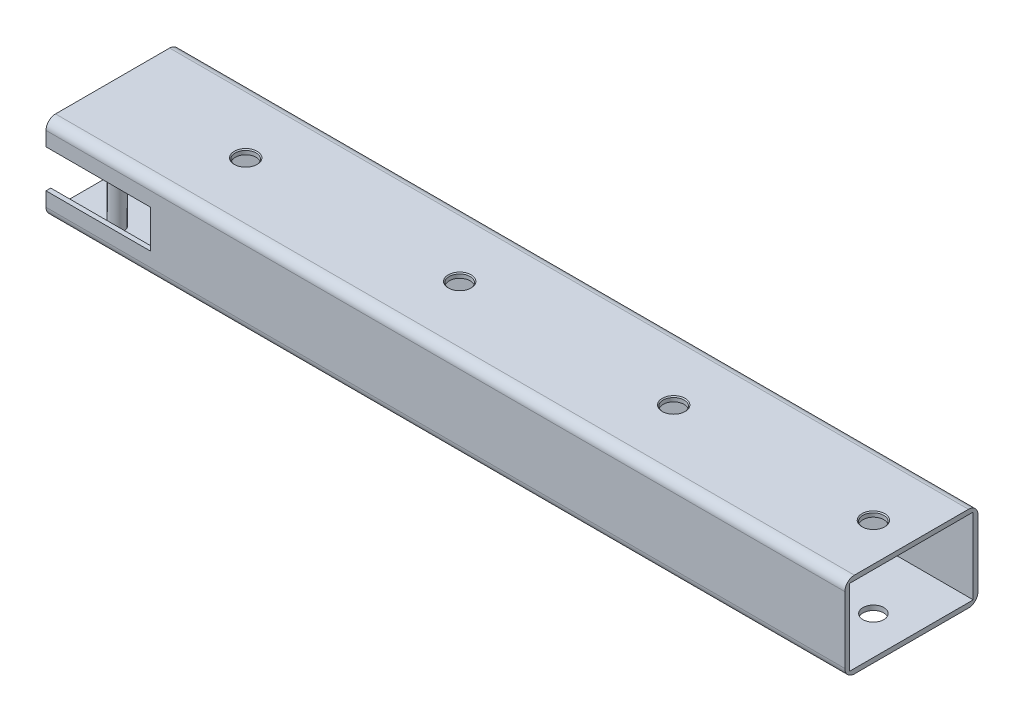
ISO-10303-21;
HEADER;
FILE_DESCRIPTION(('STEP AP214'),'2;1');
FILE_NAME('part.step','',(''),(''),'','','');
FILE_SCHEMA(('AUTOMOTIVE_DESIGN { 1 0 10303 214 1 1 1 1 }'));
ENDSEC;
DATA;
#1=APPLICATION_CONTEXT('core data for automotive mechanical design processes');
#2=APPLICATION_PROTOCOL_DEFINITION('international standard','automotive_design',2000,#1);
#3=PRODUCT_CONTEXT('',#1,'mechanical');
#4=PRODUCT('Part','Part','',(#3));
#5=PRODUCT_RELATED_PRODUCT_CATEGORY('part','',(#4));
#6=PRODUCT_DEFINITION_FORMATION('','',#4);
#7=PRODUCT_DEFINITION_CONTEXT('part definition',#1,'design');
#8=PRODUCT_DEFINITION('design','',#6,#7);
#9=PRODUCT_DEFINITION_SHAPE('','',#8);
#10=(LENGTH_UNIT() NAMED_UNIT(*) SI_UNIT(.MILLI.,.METRE.));
#11=(NAMED_UNIT(*) PLANE_ANGLE_UNIT() SI_UNIT($,.RADIAN.));
#12=(NAMED_UNIT(*) SI_UNIT($,.STERADIAN.) SOLID_ANGLE_UNIT());
#13=UNCERTAINTY_MEASURE_WITH_UNIT(LENGTH_MEASURE(1.E-05),#10,'distance_accuracy_value','');
#14=(GEOMETRIC_REPRESENTATION_CONTEXT(3) GLOBAL_UNCERTAINTY_ASSIGNED_CONTEXT((#13)) GLOBAL_UNIT_ASSIGNED_CONTEXT((#10,
#11,#12)) REPRESENTATION_CONTEXT('',''));
#15=CARTESIAN_POINT('',(0.,0.,0.));
#16=DIRECTION('',(0.,0.,1.));
#17=DIRECTION('',(1.,0.,0.));
#18=AXIS2_PLACEMENT_3D('',#15,#16,#17);
#19=CARTESIAN_POINT('',(420.,90.,70.));
#20=DIRECTION('',(-1.,0.,0.));
#21=DIRECTION('',(0.,0.,1.));
#22=AXIS2_PLACEMENT_3D('',#19,#20,#21);
#23=PLANE('',#22);
#24=DIRECTION('',(0.,1.,0.));
#25=VECTOR('',#24,1.);
#26=CARTESIAN_POINT('',(420.,0.,-65.));
#27=LINE('',#26,#25);
#28=CARTESIAN_POINT('',(420.,4.99999999999999,-65.));
#29=VERTEX_POINT('',#28);
#30=CARTESIAN_POINT('',(420.,85.,-65.));
#31=VERTEX_POINT('',#30);
#32=EDGE_CURVE('E209',#29,#31,#27,.T.);
#33=ORIENTED_EDGE('',*,*,#32,.F.);
#34=DIRECTION('',(0.,0.,-1.));
#35=VECTOR('',#34,1.);
#36=CARTESIAN_POINT('',(420.,4.99999999999999,0.));
#37=LINE('',#36,#35);
#38=CARTESIAN_POINT('',(420.,4.99999999999999,65.));
#39=VERTEX_POINT('',#38);
#40=EDGE_CURVE('E206',#39,#29,#37,.T.);
#41=ORIENTED_EDGE('',*,*,#40,.F.);
#42=DIRECTION('',(0.,1.,0.));
#43=VECTOR('',#42,1.);
#44=CARTESIAN_POINT('',(420.,0.,65.));
#45=LINE('',#44,#43);
#46=CARTESIAN_POINT('',(420.,85.,65.));
#47=VERTEX_POINT('',#46);
#48=EDGE_CURVE('E218',#39,#47,#45,.T.);
#49=ORIENTED_EDGE('',*,*,#48,.T.);
#50=DIRECTION('',(0.,0.,-1.));
#51=VECTOR('',#50,1.);
#52=CARTESIAN_POINT('',(420.,85.,0.));
#53=LINE('',#52,#51);
#54=EDGE_CURVE('E214',#47,#31,#53,.T.);
#55=ORIENTED_EDGE('',*,*,#54,.T.);
#56=EDGE_LOOP('',(#33,#41,#49,#55));
#57=FACE_BOUND('',#56,.T.);
#58=DIRECTION('',(0.,-1.,0.));
#59=VECTOR('',#58,1.);
#60=CARTESIAN_POINT('',(420.,90.,70.));
#61=LINE('',#60,#59);
#62=CARTESIAN_POINT('',(420.,80.,70.));
#63=VERTEX_POINT('',#62);
#64=CARTESIAN_POINT('',(420.,10.,70.));
#65=VERTEX_POINT('',#64);
#66=EDGE_CURVE('E238',#63,#65,#61,.T.);
#67=ORIENTED_EDGE('',*,*,#66,.T.);
#68=CARTESIAN_POINT('',(420.,9.99999999999999,60.));
#69=DIRECTION('',(-1.,0.,0.));
#70=DIRECTION('',(0.,0.,1.));
#71=AXIS2_PLACEMENT_3D('',#68,#69,#70);
#72=CIRCLE('',#71,10.);
#73=CARTESIAN_POINT('',(420.,0.,60.));
#74=VERTEX_POINT('',#73);
#75=EDGE_CURVE('E297',#65,#74,#72,.F.);
#76=ORIENTED_EDGE('',*,*,#75,.T.);
#77=DIRECTION('',(0.,0.,-1.));
#78=VECTOR('',#77,1.);
#79=CARTESIAN_POINT('',(420.,0.,70.));
#80=LINE('',#79,#78);
#81=CARTESIAN_POINT('',(420.,0.,-60.));
#82=VERTEX_POINT('',#81);
#83=EDGE_CURVE('E225',#74,#82,#80,.T.);
#84=ORIENTED_EDGE('',*,*,#83,.T.);
#85=CARTESIAN_POINT('',(420.,9.99999999999999,-60.));
#86=DIRECTION('',(-1.,0.,0.));
#87=DIRECTION('',(0.,0.,1.));
#88=AXIS2_PLACEMENT_3D('',#85,#86,#87);
#89=CIRCLE('',#88,10.);
#90=CARTESIAN_POINT('',(420.,10.,-70.));
#91=VERTEX_POINT('',#90);
#92=EDGE_CURVE('E280',#82,#91,#89,.F.);
#93=ORIENTED_EDGE('',*,*,#92,.T.);
#94=DIRECTION('',(0.,-1.,0.));
#95=VECTOR('',#94,1.);
#96=CARTESIAN_POINT('',(420.,90.,-70.));
#97=LINE('',#96,#95);
#98=CARTESIAN_POINT('',(420.,80.,-70.));
#99=VERTEX_POINT('',#98);
#100=EDGE_CURVE('E255',#99,#91,#97,.T.);
#101=ORIENTED_EDGE('',*,*,#100,.F.);
#102=CARTESIAN_POINT('',(420.,80.,-60.));
#103=DIRECTION('',(-1.,0.,0.));
#104=DIRECTION('',(0.,0.,1.));
#105=AXIS2_PLACEMENT_3D('',#102,#103,#104);
#106=CIRCLE('',#105,10.);
#107=CARTESIAN_POINT('',(420.,90.,-60.));
#108=VERTEX_POINT('',#107);
#109=EDGE_CURVE('E276',#99,#108,#106,.F.);
#110=ORIENTED_EDGE('',*,*,#109,.T.);
#111=DIRECTION('',(0.,0.,-1.));
#112=VECTOR('',#111,1.);
#113=CARTESIAN_POINT('',(420.,90.,70.));
#114=LINE('',#113,#112);
#115=CARTESIAN_POINT('',(420.,90.,60.));
#116=VERTEX_POINT('',#115);
#117=EDGE_CURVE('E231',#116,#108,#114,.T.);
#118=ORIENTED_EDGE('',*,*,#117,.F.);
#119=CARTESIAN_POINT('',(420.,80.,60.));
#120=DIRECTION('',(-1.,0.,0.));
#121=DIRECTION('',(0.,0.,1.));
#122=AXIS2_PLACEMENT_3D('',#119,#120,#121);
#123=CIRCLE('',#122,10.);
#124=EDGE_CURVE('E294',#116,#63,#123,.F.);
#125=ORIENTED_EDGE('',*,*,#124,.T.);
#126=EDGE_LOOP('',(#67,#76,#84,#93,#101,#110,#118,#125));
#127=FACE_BOUND('',#126,.T.);
#128=ADVANCED_FACE('F49',(#57,#127),#23,.F.);
#129=CARTESIAN_POINT('',(-420.,90.,-70.));
#130=DIRECTION('',(0.,0.,1.));
#131=DIRECTION('',(1.,0.,0.));
#132=AXIS2_PLACEMENT_3D('',#129,#130,#131);
#133=PLANE('',#132);
#134=ORIENTED_EDGE('',*,*,#100,.T.);
#135=DIRECTION('',(-1.,0.,0.));
#136=VECTOR('',#135,1.);
#137=CARTESIAN_POINT('',(-420.,9.99999999999999,-70.));
#138=LINE('',#137,#136);
#139=CARTESIAN_POINT('',(-420.,10.,-70.));
#140=VERTEX_POINT('',#139);
#141=EDGE_CURVE('E262',#91,#140,#138,.T.);
#142=ORIENTED_EDGE('',*,*,#141,.T.);
#143=DIRECTION('',(0.,-1.,0.));
#144=VECTOR('',#143,1.);
#145=CARTESIAN_POINT('',(-420.,90.,-70.));
#146=LINE('',#145,#144);
#147=CARTESIAN_POINT('',(-420.,80.,-70.));
#148=VERTEX_POINT('',#147);
#149=EDGE_CURVE('E251',#148,#140,#146,.T.);
#150=ORIENTED_EDGE('',*,*,#149,.F.);
#151=DIRECTION('',(-1.,0.,0.));
#152=VECTOR('',#151,1.);
#153=CARTESIAN_POINT('',(-420.,80.,-70.));
#154=LINE('',#153,#152);
#155=EDGE_CURVE('E259',#148,#99,#154,.F.);
#156=ORIENTED_EDGE('',*,*,#155,.T.);
#157=EDGE_LOOP('',(#134,#142,#150,#156));
#158=FACE_BOUND('',#157,.T.);
#159=ADVANCED_FACE('F468',(#158),#133,.F.);
#160=CARTESIAN_POINT('',(-420.,90.,-70.));
#161=DIRECTION('',(1.,0.,0.));
#162=DIRECTION('',(0.,0.,-1.));
#163=AXIS2_PLACEMENT_3D('',#160,#161,#162);
#164=PLANE('',#163);
#165=DIRECTION('',(0.,-1.,0.));
#166=VECTOR('',#165,1.);
#167=CARTESIAN_POINT('',(-420.,90.,70.));
#168=LINE('',#167,#166);
#169=CARTESIAN_POINT('',(-420.,25.,70.));
#170=VERTEX_POINT('',#169);
#171=CARTESIAN_POINT('',(-420.,10.,70.));
#172=VERTEX_POINT('',#171);
#173=EDGE_CURVE('E185',#170,#172,#168,.T.);
#174=ORIENTED_EDGE('',*,*,#173,.F.);
#175=DIRECTION('',(0.,0.,1.));
#176=VECTOR('',#175,1.);
#177=CARTESIAN_POINT('',(-420.,25.,-70.001));
#178=LINE('',#177,#176);
#179=CARTESIAN_POINT('',(-420.,25.,65.));
#180=VERTEX_POINT('',#179);
#181=EDGE_CURVE('E169',#180,#170,#178,.T.);
#182=ORIENTED_EDGE('',*,*,#181,.F.);
#183=DIRECTION('',(0.,1.,0.));
#184=VECTOR('',#183,1.);
#185=CARTESIAN_POINT('',(-420.,0.,65.));
#186=LINE('',#185,#184);
#187=CARTESIAN_POINT('',(-420.,4.99999999999999,65.));
#188=VERTEX_POINT('',#187);
#189=EDGE_CURVE('E183',#188,#180,#186,.T.);
#190=ORIENTED_EDGE('',*,*,#189,.F.);
#191=DIRECTION('',(0.,0.,-1.));
#192=VECTOR('',#191,1.);
#193=CARTESIAN_POINT('',(-420.,4.99999999999999,0.));
#194=LINE('',#193,#192);
#195=CARTESIAN_POINT('',(-420.,4.99999999999999,-65.));
#196=VERTEX_POINT('',#195);
#197=EDGE_CURVE('E222',#188,#196,#194,.T.);
#198=ORIENTED_EDGE('',*,*,#197,.T.);
#199=DIRECTION('',(0.,1.,0.));
#200=VECTOR('',#199,1.);
#201=CARTESIAN_POINT('',(-420.,0.,-65.));
#202=LINE('',#201,#200);
#203=CARTESIAN_POINT('',(-420.,85.,-65.));
#204=VERTEX_POINT('',#203);
#205=EDGE_CURVE('E391',#196,#204,#202,.T.);
#206=ORIENTED_EDGE('',*,*,#205,.T.);
#207=DIRECTION('',(0.,0.,-1.));
#208=VECTOR('',#207,1.);
#209=CARTESIAN_POINT('',(-420.,85.,0.));
#210=LINE('',#209,#208);
#211=CARTESIAN_POINT('',(-420.,85.,65.));
#212=VERTEX_POINT('',#211);
#213=EDGE_CURVE('E202',#212,#204,#210,.T.);
#214=ORIENTED_EDGE('',*,*,#213,.F.);
#215=CARTESIAN_POINT('',(-420.,65.,65.));
#216=VERTEX_POINT('',#215);
#217=EDGE_CURVE('E195',#216,#212,#186,.T.);
#218=ORIENTED_EDGE('',*,*,#217,.F.);
#219=DIRECTION('',(0.,0.,-1.));
#220=VECTOR('',#219,1.);
#221=CARTESIAN_POINT('',(-420.,65.,-70.001));
#222=LINE('',#221,#220);
#223=CARTESIAN_POINT('',(-420.,65.,70.));
#224=VERTEX_POINT('',#223);
#225=EDGE_CURVE('E65',#224,#216,#222,.T.);
#226=ORIENTED_EDGE('',*,*,#225,.F.);
#227=CARTESIAN_POINT('',(-420.,80.,70.));
#228=VERTEX_POINT('',#227);
#229=EDGE_CURVE('E247',#228,#224,#168,.T.);
#230=ORIENTED_EDGE('',*,*,#229,.F.);
#231=CARTESIAN_POINT('',(-420.,80.,60.));
#232=DIRECTION('',(1.,0.,0.));
#233=DIRECTION('',(0.,0.,-1.));
#234=AXIS2_PLACEMENT_3D('',#231,#232,#233);
#235=CIRCLE('',#234,10.);
#236=CARTESIAN_POINT('',(-420.,90.,60.));
#237=VERTEX_POINT('',#236);
#238=EDGE_CURVE('E73',#228,#237,#235,.F.);
#239=ORIENTED_EDGE('',*,*,#238,.T.);
#240=DIRECTION('',(0.,0.,1.));
#241=VECTOR('',#240,1.);
#242=CARTESIAN_POINT('',(-420.,90.,-70.));
#243=LINE('',#242,#241);
#244=CARTESIAN_POINT('',(-420.,90.,-60.));
#245=VERTEX_POINT('',#244);
#246=EDGE_CURVE('E234',#245,#237,#243,.T.);
#247=ORIENTED_EDGE('',*,*,#246,.F.);
#248=CARTESIAN_POINT('',(-420.,80.,-60.));
#249=DIRECTION('',(1.,0.,0.));
#250=DIRECTION('',(0.,0.,-1.));
#251=AXIS2_PLACEMENT_3D('',#248,#249,#250);
#252=CIRCLE('',#251,10.);
#253=EDGE_CURVE('E266',#245,#148,#252,.F.);
#254=ORIENTED_EDGE('',*,*,#253,.T.);
#255=ORIENTED_EDGE('',*,*,#149,.T.);
#256=CARTESIAN_POINT('',(-420.,9.99999999999999,-60.));
#257=DIRECTION('',(1.,0.,0.));
#258=DIRECTION('',(0.,0.,-1.));
#259=AXIS2_PLACEMENT_3D('',#256,#257,#258);
#260=CIRCLE('',#259,10.);
#261=CARTESIAN_POINT('',(-420.,0.,-60.));
#262=VERTEX_POINT('',#261);
#263=EDGE_CURVE('E269',#140,#262,#260,.F.);
#264=ORIENTED_EDGE('',*,*,#263,.T.);
#265=DIRECTION('',(0.,0.,1.));
#266=VECTOR('',#265,1.);
#267=CARTESIAN_POINT('',(-420.,0.,-70.));
#268=LINE('',#267,#266);
#269=CARTESIAN_POINT('',(-420.,0.,60.));
#270=VERTEX_POINT('',#269);
#271=EDGE_CURVE('E235',#262,#270,#268,.T.);
#272=ORIENTED_EDGE('',*,*,#271,.T.);
#273=CARTESIAN_POINT('',(-420.,9.99999999999999,60.));
#274=DIRECTION('',(1.,0.,0.));
#275=DIRECTION('',(0.,0.,-1.));
#276=AXIS2_PLACEMENT_3D('',#273,#274,#275);
#277=CIRCLE('',#276,10.);
#278=EDGE_CURVE('E305',#270,#172,#277,.F.);
#279=ORIENTED_EDGE('',*,*,#278,.T.);
#280=EDGE_LOOP('',(#174,#182,#190,#198,#206,#214,#218,#226,#230,#239,#247,#254,#255,#264,#272,#279));
#281=FACE_BOUND('',#280,.T.);
#282=ADVANCED_FACE('F181',(#281),#164,.F.);
#283=CARTESIAN_POINT('',(-420.,90.,70.));
#284=DIRECTION('',(0.,0.,-1.));
#285=DIRECTION('',(-1.,0.,0.));
#286=AXIS2_PLACEMENT_3D('',#283,#284,#285);
#287=PLANE('',#286);
#288=DIRECTION('',(0.,1.,0.));
#289=VECTOR('',#288,1.);
#290=CARTESIAN_POINT('',(-310.,65.,70.));
#291=LINE('',#290,#289);
#292=CARTESIAN_POINT('',(-310.,25.,70.));
#293=VERTEX_POINT('',#292);
#294=CARTESIAN_POINT('',(-310.,65.,70.));
#295=VERTEX_POINT('',#294);
#296=EDGE_CURVE('E411',#293,#295,#291,.T.);
#297=ORIENTED_EDGE('',*,*,#296,.F.);
#298=DIRECTION('',(1.,0.,0.));
#299=VECTOR('',#298,1.);
#300=CARTESIAN_POINT('',(-310.,25.,70.));
#301=LINE('',#300,#299);
#302=EDGE_CURVE('E407',#170,#293,#301,.T.);
#303=ORIENTED_EDGE('',*,*,#302,.F.);
#304=ORIENTED_EDGE('',*,*,#173,.T.);
#305=DIRECTION('',(1.,0.,0.));
#306=VECTOR('',#305,1.);
#307=CARTESIAN_POINT('',(420.,9.99999999999999,70.));
#308=LINE('',#307,#306);
#309=EDGE_CURVE('E290',#172,#65,#308,.T.);
#310=ORIENTED_EDGE('',*,*,#309,.T.);
#311=ORIENTED_EDGE('',*,*,#66,.F.);
#312=DIRECTION('',(1.,0.,0.));
#313=VECTOR('',#312,1.);
#314=CARTESIAN_POINT('',(-420.,80.,70.));
#315=LINE('',#314,#313);
#316=EDGE_CURVE('E287',#63,#228,#315,.F.);
#317=ORIENTED_EDGE('',*,*,#316,.T.);
#318=ORIENTED_EDGE('',*,*,#229,.T.);
#319=DIRECTION('',(-1.,0.,0.));
#320=VECTOR('',#319,1.);
#321=CARTESIAN_POINT('',(-310.,65.,70.));
#322=LINE('',#321,#320);
#323=EDGE_CURVE('E419',#295,#224,#322,.T.);
#324=ORIENTED_EDGE('',*,*,#323,.F.);
#325=EDGE_LOOP('',(#297,#303,#304,#310,#311,#317,#318,#324));
#326=FACE_BOUND('',#325,.T.);
#327=ADVANCED_FACE('F435',(#326),#287,.F.);
#328=CARTESIAN_POINT('',(0.,90.,0.));
#329=DIRECTION('',(0.,-1.,0.));
#330=DIRECTION('',(0.,0.,-1.));
#331=AXIS2_PLACEMENT_3D('',#328,#329,#330);
#332=PLANE('',#331);
#333=CARTESIAN_POINT('',(-54.9999999999999,90.,0.));
#334=DIRECTION('',(0.,1.,0.));
#335=DIRECTION('',(0.,0.,1.));
#336=AXIS2_PLACEMENT_3D('',#333,#334,#335);
#337=CIRCLE('',#336,12.025);
#338=CARTESIAN_POINT('',(-54.9999999999999,90.,12.025));
#339=VERTEX_POINT('',#338);
#340=EDGE_CURVE('E176',#339,#339,#337,.T.);
#341=ORIENTED_EDGE('',*,*,#340,.F.);
#342=EDGE_LOOP('',(#341));
#343=FACE_BOUND('',#342,.T.);
#344=CARTESIAN_POINT('',(170.,90.,0.));
#345=DIRECTION('',(0.,1.,0.));
#346=DIRECTION('',(0.,0.,1.));
#347=AXIS2_PLACEMENT_3D('',#344,#345,#346);
#348=CIRCLE('',#347,12.025);
#349=CARTESIAN_POINT('',(170.,90.,12.025));
#350=VERTEX_POINT('',#349);
#351=EDGE_CURVE('E337',#350,#350,#348,.T.);
#352=ORIENTED_EDGE('',*,*,#351,.F.);
#353=EDGE_LOOP('',(#352));
#354=FACE_BOUND('',#353,.T.);
#355=CARTESIAN_POINT('',(-280.,90.,0.));
#356=DIRECTION('',(0.,1.,0.));
#357=DIRECTION('',(0.,0.,1.));
#358=AXIS2_PLACEMENT_3D('',#355,#356,#357);
#359=CIRCLE('',#358,12.025);
#360=CARTESIAN_POINT('',(-280.,90.,12.025));
#361=VERTEX_POINT('',#360);
#362=EDGE_CURVE('E362',#361,#361,#359,.T.);
#363=ORIENTED_EDGE('',*,*,#362,.F.);
#364=EDGE_LOOP('',(#363));
#365=FACE_BOUND('',#364,.T.);
#366=CARTESIAN_POINT('',(380.,90.,0.));
#367=DIRECTION('',(0.,1.,0.));
#368=DIRECTION('',(0.,0.,1.));
#369=AXIS2_PLACEMENT_3D('',#366,#367,#368);
#370=CIRCLE('',#369,12.025);
#371=CARTESIAN_POINT('',(380.,90.,12.025));
#372=VERTEX_POINT('',#371);
#373=EDGE_CURVE('E376',#372,#372,#370,.T.);
#374=ORIENTED_EDGE('',*,*,#373,.F.);
#375=EDGE_LOOP('',(#374));
#376=FACE_BOUND('',#375,.T.);
#377=ORIENTED_EDGE('',*,*,#246,.T.);
#378=DIRECTION('',(1.,0.,0.));
#379=VECTOR('',#378,1.);
#380=CARTESIAN_POINT('',(0.,90.,60.));
#381=LINE('',#380,#379);
#382=EDGE_CURVE('E58',#237,#116,#381,.T.);
#383=ORIENTED_EDGE('',*,*,#382,.T.);
#384=ORIENTED_EDGE('',*,*,#117,.T.);
#385=DIRECTION('',(-1.,0.,0.));
#386=VECTOR('',#385,1.);
#387=CARTESIAN_POINT('',(0.,90.,-60.));
#388=LINE('',#387,#386);
#389=EDGE_CURVE('E283',#108,#245,#388,.T.);
#390=ORIENTED_EDGE('',*,*,#389,.T.);
#391=EDGE_LOOP('',(#377,#383,#384,#390));
#392=FACE_BOUND('',#391,.T.);
#393=ADVANCED_FACE('F431',(#343,#354,#365,#376,#392),#332,.F.);
#394=CARTESIAN_POINT('',(0.,0.,0.));
#395=DIRECTION('',(0.,-1.,0.));
#396=DIRECTION('',(0.,0.,-1.));
#397=AXIS2_PLACEMENT_3D('',#394,#395,#396);
#398=PLANE('',#397);
#399=CARTESIAN_POINT('',(-54.9999999999999,0.,0.));
#400=DIRECTION('',(0.,1.,0.));
#401=DIRECTION('',(0.,0.,1.));
#402=AXIS2_PLACEMENT_3D('',#399,#400,#401);
#403=CIRCLE('',#402,11.);
#404=CARTESIAN_POINT('',(-54.9999999999999,0.,11.));
#405=VERTEX_POINT('',#404);
#406=EDGE_CURVE('E331',#405,#405,#403,.T.);
#407=ORIENTED_EDGE('',*,*,#406,.T.);
#408=EDGE_LOOP('',(#407));
#409=FACE_BOUND('',#408,.T.);
#410=CARTESIAN_POINT('',(170.,0.,0.));
#411=DIRECTION('',(0.,1.,0.));
#412=DIRECTION('',(0.,0.,1.));
#413=AXIS2_PLACEMENT_3D('',#410,#411,#412);
#414=CIRCLE('',#413,11.);
#415=CARTESIAN_POINT('',(170.,0.,11.));
#416=VERTEX_POINT('',#415);
#417=EDGE_CURVE('E326',#416,#416,#414,.T.);
#418=ORIENTED_EDGE('',*,*,#417,.T.);
#419=EDGE_LOOP('',(#418));
#420=FACE_BOUND('',#419,.T.);
#421=CARTESIAN_POINT('',(-280.,0.,0.));
#422=DIRECTION('',(0.,1.,0.));
#423=DIRECTION('',(0.,0.,1.));
#424=AXIS2_PLACEMENT_3D('',#421,#422,#423);
#425=CIRCLE('',#424,11.);
#426=CARTESIAN_POINT('',(-280.,0.,11.));
#427=VERTEX_POINT('',#426);
#428=EDGE_CURVE('E321',#427,#427,#425,.T.);
#429=ORIENTED_EDGE('',*,*,#428,.T.);
#430=EDGE_LOOP('',(#429));
#431=FACE_BOUND('',#430,.T.);
#432=CARTESIAN_POINT('',(380.,0.,0.));
#433=DIRECTION('',(0.,1.,0.));
#434=DIRECTION('',(0.,0.,1.));
#435=AXIS2_PLACEMENT_3D('',#432,#433,#434);
#436=CIRCLE('',#435,11.);
#437=CARTESIAN_POINT('',(380.,0.,11.));
#438=VERTEX_POINT('',#437);
#439=EDGE_CURVE('E315',#438,#438,#436,.T.);
#440=ORIENTED_EDGE('',*,*,#439,.T.);
#441=EDGE_LOOP('',(#440));
#442=FACE_BOUND('',#441,.T.);
#443=ORIENTED_EDGE('',*,*,#83,.F.);
#444=DIRECTION('',(1.,0.,0.));
#445=VECTOR('',#444,1.);
#446=CARTESIAN_POINT('',(-420.,0.,60.));
#447=LINE('',#446,#445);
#448=EDGE_CURVE('E300',#74,#270,#447,.F.);
#449=ORIENTED_EDGE('',*,*,#448,.T.);
#450=ORIENTED_EDGE('',*,*,#271,.F.);
#451=DIRECTION('',(-1.,0.,0.));
#452=VECTOR('',#451,1.);
#453=CARTESIAN_POINT('',(420.,0.,-60.));
#454=LINE('',#453,#452);
#455=EDGE_CURVE('E272',#262,#82,#454,.F.);
#456=ORIENTED_EDGE('',*,*,#455,.T.);
#457=EDGE_LOOP('',(#443,#449,#450,#456));
#458=FACE_BOUND('',#457,.T.);
#459=ADVANCED_FACE('F434',(#409,#420,#431,#442,#458),#398,.T.);
#460=CARTESIAN_POINT('',(-420.,4.99999999999999,0.));
#461=DIRECTION('',(0.,-1.,0.));
#462=DIRECTION('',(0.,0.,-1.));
#463=AXIS2_PLACEMENT_3D('',#460,#461,#462);
#464=PLANE('',#463);
#465=CARTESIAN_POINT('',(-370.,4.99999999999999,45.));
#466=DIRECTION('',(0.,-1.,0.));
#467=DIRECTION('',(0.,0.,-1.));
#468=AXIS2_PLACEMENT_3D('',#465,#466,#467);
#469=CIRCLE('',#468,7.50000000000001);
#470=CARTESIAN_POINT('',(-370.,4.99999999999999,37.5));
#471=VERTEX_POINT('',#470);
#472=EDGE_CURVE('E11',#471,#471,#469,.F.);
#473=ORIENTED_EDGE('',*,*,#472,.F.);
#474=EDGE_LOOP('',(#473));
#475=FACE_BOUND('',#474,.T.);
#476=CARTESIAN_POINT('',(-54.9999999999999,4.99999999999999,0.));
#477=DIRECTION('',(0.,-1.,0.));
#478=DIRECTION('',(0.,0.,-1.));
#479=AXIS2_PLACEMENT_3D('',#476,#477,#478);
#480=CIRCLE('',#479,11.);
#481=CARTESIAN_POINT('',(-54.9999999999999,4.99999999999999,-11.));
#482=VERTEX_POINT('',#481);
#483=EDGE_CURVE('E330',#482,#482,#480,.T.);
#484=ORIENTED_EDGE('',*,*,#483,.T.);
#485=EDGE_LOOP('',(#484));
#486=FACE_BOUND('',#485,.T.);
#487=CARTESIAN_POINT('',(170.,4.99999999999999,0.));
#488=DIRECTION('',(0.,-1.,0.));
#489=DIRECTION('',(0.,0.,-1.));
#490=AXIS2_PLACEMENT_3D('',#487,#488,#489);
#491=CIRCLE('',#490,11.);
#492=CARTESIAN_POINT('',(170.,4.99999999999999,-11.));
#493=VERTEX_POINT('',#492);
#494=EDGE_CURVE('E322',#493,#493,#491,.T.);
#495=ORIENTED_EDGE('',*,*,#494,.T.);
#496=EDGE_LOOP('',(#495));
#497=FACE_BOUND('',#496,.T.);
#498=CARTESIAN_POINT('',(-280.,4.99999999999999,0.));
#499=DIRECTION('',(0.,-1.,0.));
#500=DIRECTION('',(0.,0.,-1.));
#501=AXIS2_PLACEMENT_3D('',#498,#499,#500);
#502=CIRCLE('',#501,11.);
#503=CARTESIAN_POINT('',(-280.,4.99999999999999,-11.));
#504=VERTEX_POINT('',#503);
#505=EDGE_CURVE('E320',#504,#504,#502,.T.);
#506=ORIENTED_EDGE('',*,*,#505,.T.);
#507=EDGE_LOOP('',(#506));
#508=FACE_BOUND('',#507,.T.);
#509=CARTESIAN_POINT('',(380.,4.99999999999999,0.));
#510=DIRECTION('',(0.,-1.,0.));
#511=DIRECTION('',(0.,0.,-1.));
#512=AXIS2_PLACEMENT_3D('',#509,#510,#511);
#513=CIRCLE('',#512,11.);
#514=CARTESIAN_POINT('',(380.,4.99999999999999,-11.));
#515=VERTEX_POINT('',#514);
#516=EDGE_CURVE('E210',#515,#515,#513,.T.);
#517=ORIENTED_EDGE('',*,*,#516,.T.);
#518=EDGE_LOOP('',(#517));
#519=FACE_BOUND('',#518,.T.);
#520=ORIENTED_EDGE('',*,*,#40,.T.);
#521=DIRECTION('',(1.,0.,0.));
#522=VECTOR('',#521,1.);
#523=CARTESIAN_POINT('',(-420.,4.99999999999999,-65.));
#524=LINE('',#523,#522);
#525=EDGE_CURVE('E194',#196,#29,#524,.T.);
#526=ORIENTED_EDGE('',*,*,#525,.F.);
#527=ORIENTED_EDGE('',*,*,#197,.F.);
#528=DIRECTION('',(1.,0.,0.));
#529=VECTOR('',#528,1.);
#530=CARTESIAN_POINT('',(-420.,4.99999999999999,65.));
#531=LINE('',#530,#529);
#532=EDGE_CURVE('E191',#188,#39,#531,.T.);
#533=ORIENTED_EDGE('',*,*,#532,.T.);
#534=EDGE_LOOP('',(#520,#526,#527,#533));
#535=FACE_BOUND('',#534,.T.);
#536=ADVANCED_FACE('F495',(#475,#486,#497,#508,#519,#535),#464,.F.);
#537=CARTESIAN_POINT('',(-420.,0.,65.));
#538=DIRECTION('',(0.,0.,-1.));
#539=DIRECTION('',(-1.,0.,0.));
#540=AXIS2_PLACEMENT_3D('',#537,#538,#539);
#541=PLANE('',#540);
#542=DIRECTION('',(1.,0.,0.));
#543=VECTOR('',#542,1.);
#544=CARTESIAN_POINT('',(-310.,25.,65.));
#545=LINE('',#544,#543);
#546=CARTESIAN_POINT('',(-310.,25.,65.));
#547=VERTEX_POINT('',#546);
#548=EDGE_CURVE('E165',#180,#547,#545,.T.);
#549=ORIENTED_EDGE('',*,*,#548,.T.);
#550=DIRECTION('',(0.,1.,0.));
#551=VECTOR('',#550,1.);
#552=CARTESIAN_POINT('',(-310.,65.,65.));
#553=LINE('',#552,#551);
#554=CARTESIAN_POINT('',(-310.,65.,65.));
#555=VERTEX_POINT('',#554);
#556=EDGE_CURVE('E404',#547,#555,#553,.T.);
#557=ORIENTED_EDGE('',*,*,#556,.T.);
#558=DIRECTION('',(-1.,0.,0.));
#559=VECTOR('',#558,1.);
#560=CARTESIAN_POINT('',(-310.,65.,65.));
#561=LINE('',#560,#559);
#562=EDGE_CURVE('E403',#555,#216,#561,.T.);
#563=ORIENTED_EDGE('',*,*,#562,.T.);
#564=ORIENTED_EDGE('',*,*,#217,.T.);
#565=DIRECTION('',(1.,0.,0.));
#566=VECTOR('',#565,1.);
#567=CARTESIAN_POINT('',(-420.,85.,65.));
#568=LINE('',#567,#566);
#569=EDGE_CURVE('E226',#212,#47,#568,.T.);
#570=ORIENTED_EDGE('',*,*,#569,.T.);
#571=ORIENTED_EDGE('',*,*,#48,.F.);
#572=ORIENTED_EDGE('',*,*,#532,.F.);
#573=ORIENTED_EDGE('',*,*,#189,.T.);
#574=EDGE_LOOP('',(#549,#557,#563,#564,#570,#571,#572,#573));
#575=FACE_BOUND('',#574,.T.);
#576=ADVANCED_FACE('F189',(#575),#541,.T.);
#577=CARTESIAN_POINT('',(-420.,85.,0.));
#578=DIRECTION('',(0.,-1.,0.));
#579=DIRECTION('',(0.,0.,-1.));
#580=AXIS2_PLACEMENT_3D('',#577,#578,#579);
#581=PLANE('',#580);
#582=CARTESIAN_POINT('',(-370.,85.,45.));
#583=DIRECTION('',(0.,-1.,0.));
#584=DIRECTION('',(0.,0.,-1.));
#585=AXIS2_PLACEMENT_3D('',#582,#583,#584);
#586=CIRCLE('',#585,7.50000000000001);
#587=CARTESIAN_POINT('',(-370.,85.,37.5));
#588=VERTEX_POINT('',#587);
#589=EDGE_CURVE('E187',#588,#588,#586,.T.);
#590=ORIENTED_EDGE('',*,*,#589,.F.);
#591=EDGE_LOOP('',(#590));
#592=FACE_BOUND('',#591,.T.);
#593=CARTESIAN_POINT('',(-54.9999999999999,85.,0.));
#594=DIRECTION('',(0.,-1.,0.));
#595=DIRECTION('',(0.,0.,-1.));
#596=AXIS2_PLACEMENT_3D('',#593,#594,#595);
#597=CIRCLE('',#596,11.);
#598=CARTESIAN_POINT('',(-54.9999999999999,85.,-11.));
#599=VERTEX_POINT('',#598);
#600=EDGE_CURVE('E327',#599,#599,#597,.T.);
#601=ORIENTED_EDGE('',*,*,#600,.F.);
#602=EDGE_LOOP('',(#601));
#603=FACE_BOUND('',#602,.T.);
#604=CARTESIAN_POINT('',(170.,85.,0.));
#605=DIRECTION('',(0.,-1.,0.));
#606=DIRECTION('',(0.,0.,-1.));
#607=AXIS2_PLACEMENT_3D('',#604,#605,#606);
#608=CIRCLE('',#607,11.);
#609=CARTESIAN_POINT('',(170.,85.,-11.));
#610=VERTEX_POINT('',#609);
#611=EDGE_CURVE('E325',#610,#610,#608,.T.);
#612=ORIENTED_EDGE('',*,*,#611,.F.);
#613=EDGE_LOOP('',(#612));
#614=FACE_BOUND('',#613,.T.);
#615=CARTESIAN_POINT('',(-280.,85.,0.));
#616=DIRECTION('',(0.,-1.,0.));
#617=DIRECTION('',(0.,0.,-1.));
#618=AXIS2_PLACEMENT_3D('',#615,#616,#617);
#619=CIRCLE('',#618,11.);
#620=CARTESIAN_POINT('',(-280.,85.,-11.));
#621=VERTEX_POINT('',#620);
#622=EDGE_CURVE('E316',#621,#621,#619,.T.);
#623=ORIENTED_EDGE('',*,*,#622,.F.);
#624=EDGE_LOOP('',(#623));
#625=FACE_BOUND('',#624,.T.);
#626=CARTESIAN_POINT('',(380.,85.,0.));
#627=DIRECTION('',(0.,-1.,0.));
#628=DIRECTION('',(0.,0.,-1.));
#629=AXIS2_PLACEMENT_3D('',#626,#627,#628);
#630=CIRCLE('',#629,11.);
#631=CARTESIAN_POINT('',(380.,85.,-11.));
#632=VERTEX_POINT('',#631);
#633=EDGE_CURVE('E311',#632,#632,#630,.T.);
#634=ORIENTED_EDGE('',*,*,#633,.F.);
#635=EDGE_LOOP('',(#634));
#636=FACE_BOUND('',#635,.T.);
#637=ORIENTED_EDGE('',*,*,#54,.F.);
#638=ORIENTED_EDGE('',*,*,#569,.F.);
#639=ORIENTED_EDGE('',*,*,#213,.T.);
#640=DIRECTION('',(1.,0.,0.));
#641=VECTOR('',#640,1.);
#642=CARTESIAN_POINT('',(-420.,85.,-65.));
#643=LINE('',#642,#641);
#644=EDGE_CURVE('E200',#204,#31,#643,.T.);
#645=ORIENTED_EDGE('',*,*,#644,.T.);
#646=EDGE_LOOP('',(#637,#638,#639,#645));
#647=FACE_BOUND('',#646,.T.);
#648=ADVANCED_FACE('F401',(#592,#603,#614,#625,#636,#647),#581,.T.);
#649=CARTESIAN_POINT('',(-420.,0.,-65.));
#650=DIRECTION('',(0.,0.,-1.));
#651=DIRECTION('',(0.,1.,0.));
#652=AXIS2_PLACEMENT_3D('',#649,#650,#651);
#653=PLANE('',#652);
#654=ORIENTED_EDGE('',*,*,#32,.T.);
#655=ORIENTED_EDGE('',*,*,#644,.F.);
#656=ORIENTED_EDGE('',*,*,#205,.F.);
#657=ORIENTED_EDGE('',*,*,#525,.T.);
#658=EDGE_LOOP('',(#654,#655,#656,#657));
#659=FACE_BOUND('',#658,.T.);
#660=ADVANCED_FACE('F479',(#659),#653,.F.);
#661=CARTESIAN_POINT('',(-420.,9.99999999999999,-60.));
#662=DIRECTION('',(1.,0.,0.));
#663=DIRECTION('',(0.,0.,-1.));
#664=AXIS2_PLACEMENT_3D('',#661,#662,#663);
#665=CYLINDRICAL_SURFACE('',#664,10.);
#666=ORIENTED_EDGE('',*,*,#92,.F.);
#667=ORIENTED_EDGE('',*,*,#455,.F.);
#668=ORIENTED_EDGE('',*,*,#263,.F.);
#669=ORIENTED_EDGE('',*,*,#141,.F.);
#670=EDGE_LOOP('',(#666,#667,#668,#669));
#671=FACE_BOUND('',#670,.T.);
#672=ADVANCED_FACE('F464',(#671),#665,.T.);
#673=CARTESIAN_POINT('',(0.,80.,-60.));
#674=DIRECTION('',(-1.,0.,0.));
#675=DIRECTION('',(0.,0.,1.));
#676=AXIS2_PLACEMENT_3D('',#673,#674,#675);
#677=CYLINDRICAL_SURFACE('',#676,10.);
#678=ORIENTED_EDGE('',*,*,#109,.F.);
#679=ORIENTED_EDGE('',*,*,#155,.F.);
#680=ORIENTED_EDGE('',*,*,#253,.F.);
#681=ORIENTED_EDGE('',*,*,#389,.F.);
#682=EDGE_LOOP('',(#678,#679,#680,#681));
#683=FACE_BOUND('',#682,.T.);
#684=ADVANCED_FACE('F472',(#683),#677,.T.);
#685=CARTESIAN_POINT('',(-420.,9.99999999999999,60.));
#686=DIRECTION('',(-1.,0.,0.));
#687=DIRECTION('',(0.,0.,1.));
#688=AXIS2_PLACEMENT_3D('',#685,#686,#687);
#689=CYLINDRICAL_SURFACE('',#688,10.);
#690=ORIENTED_EDGE('',*,*,#278,.F.);
#691=ORIENTED_EDGE('',*,*,#448,.F.);
#692=ORIENTED_EDGE('',*,*,#75,.F.);
#693=ORIENTED_EDGE('',*,*,#309,.F.);
#694=EDGE_LOOP('',(#690,#691,#692,#693));
#695=FACE_BOUND('',#694,.T.);
#696=ADVANCED_FACE('F455',(#695),#689,.T.);
#697=CARTESIAN_POINT('',(0.,80.,60.));
#698=DIRECTION('',(1.,0.,0.));
#699=DIRECTION('',(0.,0.,-1.));
#700=AXIS2_PLACEMENT_3D('',#697,#698,#699);
#701=CYLINDRICAL_SURFACE('',#700,10.);
#702=ORIENTED_EDGE('',*,*,#238,.F.);
#703=ORIENTED_EDGE('',*,*,#316,.F.);
#704=ORIENTED_EDGE('',*,*,#124,.F.);
#705=ORIENTED_EDGE('',*,*,#382,.F.);
#706=EDGE_LOOP('',(#702,#703,#704,#705));
#707=FACE_BOUND('',#706,.T.);
#708=ADVANCED_FACE('F51',(#707),#701,.T.);
#709=CARTESIAN_POINT('',(380.,90.,0.));
#710=DIRECTION('',(0.,1.,0.));
#711=DIRECTION('',(0.,0.,1.));
#712=AXIS2_PLACEMENT_3D('',#709,#710,#711);
#713=CYLINDRICAL_SURFACE('',#712,11.);
#714=ORIENTED_EDGE('',*,*,#633,.T.);
#715=EDGE_LOOP('',(#714));
#716=FACE_BOUND('',#715,.T.);
#717=CARTESIAN_POINT('',(380.,88.975,0.));
#718=DIRECTION('',(0.,1.,0.));
#719=DIRECTION('',(0.,0.,1.));
#720=AXIS2_PLACEMENT_3D('',#717,#718,#719);
#721=CIRCLE('',#720,11.);
#722=CARTESIAN_POINT('',(380.,88.975,11.));
#723=VERTEX_POINT('',#722);
#724=EDGE_CURVE('E380',#723,#723,#721,.T.);
#725=ORIENTED_EDGE('',*,*,#724,.T.);
#726=EDGE_LOOP('',(#725));
#727=FACE_BOUND('',#726,.T.);
#728=ADVANCED_FACE('F508',(#716,#727),#713,.F.);
#729=CARTESIAN_POINT('',(380.,90.,0.));
#730=DIRECTION('',(0.,1.,0.));
#731=DIRECTION('',(0.,0.,1.));
#732=AXIS2_PLACEMENT_3D('',#729,#730,#731);
#733=CONICAL_SURFACE('',#732,12.025,0.785398163397448);
#734=ORIENTED_EDGE('',*,*,#724,.F.);
#735=EDGE_LOOP('',(#734));
#736=FACE_BOUND('',#735,.T.);
#737=ORIENTED_EDGE('',*,*,#373,.T.);
#738=EDGE_LOOP('',(#737));
#739=FACE_BOUND('',#738,.T.);
#740=ADVANCED_FACE('F511',(#736,#739),#733,.F.);
#741=ORIENTED_EDGE('',*,*,#439,.F.);
#742=EDGE_LOOP('',(#741));
#743=FACE_BOUND('',#742,.T.);
#744=ORIENTED_EDGE('',*,*,#516,.F.);
#745=EDGE_LOOP('',(#744));
#746=FACE_BOUND('',#745,.T.);
#747=ADVANCED_FACE('F513',(#743,#746),#713,.F.);
#748=CARTESIAN_POINT('',(-280.,90.,0.));
#749=DIRECTION('',(0.,1.,0.));
#750=DIRECTION('',(0.,0.,1.));
#751=AXIS2_PLACEMENT_3D('',#748,#749,#750);
#752=CYLINDRICAL_SURFACE('',#751,11.);
#753=ORIENTED_EDGE('',*,*,#622,.T.);
#754=EDGE_LOOP('',(#753));
#755=FACE_BOUND('',#754,.T.);
#756=CARTESIAN_POINT('',(-280.,88.975,0.));
#757=DIRECTION('',(0.,1.,0.));
#758=DIRECTION('',(0.,0.,1.));
#759=AXIS2_PLACEMENT_3D('',#756,#757,#758);
#760=CIRCLE('',#759,11.);
#761=CARTESIAN_POINT('',(-280.,88.975,11.));
#762=VERTEX_POINT('',#761);
#763=EDGE_CURVE('E366',#762,#762,#760,.T.);
#764=ORIENTED_EDGE('',*,*,#763,.T.);
#765=EDGE_LOOP('',(#764));
#766=FACE_BOUND('',#765,.T.);
#767=ADVANCED_FACE('F517',(#755,#766),#752,.F.);
#768=CARTESIAN_POINT('',(-280.,90.,0.));
#769=DIRECTION('',(0.,1.,0.));
#770=DIRECTION('',(0.,0.,1.));
#771=AXIS2_PLACEMENT_3D('',#768,#769,#770);
#772=CONICAL_SURFACE('',#771,12.025,0.785398163397448);
#773=ORIENTED_EDGE('',*,*,#763,.F.);
#774=EDGE_LOOP('',(#773));
#775=FACE_BOUND('',#774,.T.);
#776=ORIENTED_EDGE('',*,*,#362,.T.);
#777=EDGE_LOOP('',(#776));
#778=FACE_BOUND('',#777,.T.);
#779=ADVANCED_FACE('F520',(#775,#778),#772,.F.);
#780=ORIENTED_EDGE('',*,*,#428,.F.);
#781=EDGE_LOOP('',(#780));
#782=FACE_BOUND('',#781,.T.);
#783=ORIENTED_EDGE('',*,*,#505,.F.);
#784=EDGE_LOOP('',(#783));
#785=FACE_BOUND('',#784,.T.);
#786=ADVANCED_FACE('F522',(#782,#785),#752,.F.);
#787=CARTESIAN_POINT('',(170.,90.,0.));
#788=DIRECTION('',(0.,1.,0.));
#789=DIRECTION('',(0.,0.,1.));
#790=AXIS2_PLACEMENT_3D('',#787,#788,#789);
#791=CYLINDRICAL_SURFACE('',#790,11.);
#792=ORIENTED_EDGE('',*,*,#417,.F.);
#793=EDGE_LOOP('',(#792));
#794=FACE_BOUND('',#793,.T.);
#795=ORIENTED_EDGE('',*,*,#494,.F.);
#796=EDGE_LOOP('',(#795));
#797=FACE_BOUND('',#796,.T.);
#798=ADVANCED_FACE('F530',(#794,#797),#791,.F.);
#799=ORIENTED_EDGE('',*,*,#611,.T.);
#800=EDGE_LOOP('',(#799));
#801=FACE_BOUND('',#800,.T.);
#802=CARTESIAN_POINT('',(170.,88.975,0.));
#803=DIRECTION('',(0.,1.,0.));
#804=DIRECTION('',(0.,0.,1.));
#805=AXIS2_PLACEMENT_3D('',#802,#803,#804);
#806=CIRCLE('',#805,11.);
#807=CARTESIAN_POINT('',(170.,88.975,11.));
#808=VERTEX_POINT('',#807);
#809=EDGE_CURVE('E352',#808,#808,#806,.T.);
#810=ORIENTED_EDGE('',*,*,#809,.T.);
#811=EDGE_LOOP('',(#810));
#812=FACE_BOUND('',#811,.T.);
#813=ADVANCED_FACE('F526',(#801,#812),#791,.F.);
#814=CARTESIAN_POINT('',(170.,90.,0.));
#815=DIRECTION('',(0.,1.,0.));
#816=DIRECTION('',(0.,0.,1.));
#817=AXIS2_PLACEMENT_3D('',#814,#815,#816);
#818=CONICAL_SURFACE('',#817,12.025,0.785398163397448);
#819=ORIENTED_EDGE('',*,*,#809,.F.);
#820=EDGE_LOOP('',(#819));
#821=FACE_BOUND('',#820,.T.);
#822=ORIENTED_EDGE('',*,*,#351,.T.);
#823=EDGE_LOOP('',(#822));
#824=FACE_BOUND('',#823,.T.);
#825=ADVANCED_FACE('F529',(#821,#824),#818,.F.);
#826=CARTESIAN_POINT('',(-54.9999999999999,90.,0.));
#827=DIRECTION('',(0.,1.,0.));
#828=DIRECTION('',(0.,0.,1.));
#829=AXIS2_PLACEMENT_3D('',#826,#827,#828);
#830=CYLINDRICAL_SURFACE('',#829,11.);
#831=ORIENTED_EDGE('',*,*,#600,.T.);
#832=EDGE_LOOP('',(#831));
#833=FACE_BOUND('',#832,.T.);
#834=CARTESIAN_POINT('',(-54.9999999999999,88.975,0.));
#835=DIRECTION('',(0.,1.,0.));
#836=DIRECTION('',(0.,0.,1.));
#837=AXIS2_PLACEMENT_3D('',#834,#835,#836);
#838=CIRCLE('',#837,11.);
#839=CARTESIAN_POINT('',(-54.9999999999999,88.975,11.));
#840=VERTEX_POINT('',#839);
#841=EDGE_CURVE('E340',#840,#840,#838,.T.);
#842=ORIENTED_EDGE('',*,*,#841,.T.);
#843=EDGE_LOOP('',(#842));
#844=FACE_BOUND('',#843,.T.);
#845=ADVANCED_FACE('F534',(#833,#844),#830,.F.);
#846=CARTESIAN_POINT('',(-54.9999999999999,90.,0.));
#847=DIRECTION('',(0.,1.,0.));
#848=DIRECTION('',(0.,0.,1.));
#849=AXIS2_PLACEMENT_3D('',#846,#847,#848);
#850=CONICAL_SURFACE('',#849,12.025,0.785398163397452);
#851=ORIENTED_EDGE('',*,*,#841,.F.);
#852=EDGE_LOOP('',(#851));
#853=FACE_BOUND('',#852,.T.);
#854=ORIENTED_EDGE('',*,*,#340,.T.);
#855=EDGE_LOOP('',(#854));
#856=FACE_BOUND('',#855,.T.);
#857=ADVANCED_FACE('F429',(#853,#856),#850,.F.);
#858=ORIENTED_EDGE('',*,*,#406,.F.);
#859=EDGE_LOOP('',(#858));
#860=FACE_BOUND('',#859,.T.);
#861=ORIENTED_EDGE('',*,*,#483,.F.);
#862=EDGE_LOOP('',(#861));
#863=FACE_BOUND('',#862,.T.);
#864=ADVANCED_FACE('F538',(#860,#863),#830,.F.);
#865=CARTESIAN_POINT('',(-310.,25.,-70.001));
#866=DIRECTION('',(0.,-1.,0.));
#867=DIRECTION('',(1.,0.,0.));
#868=AXIS2_PLACEMENT_3D('',#865,#866,#867);
#869=PLANE('',#868);
#870=ORIENTED_EDGE('',*,*,#181,.T.);
#871=ORIENTED_EDGE('',*,*,#302,.T.);
#872=DIRECTION('',(0.,0.,1.));
#873=VECTOR('',#872,1.);
#874=CARTESIAN_POINT('',(-310.,25.,-70.001));
#875=LINE('',#874,#873);
#876=EDGE_CURVE('E171',#547,#293,#875,.T.);
#877=ORIENTED_EDGE('',*,*,#876,.F.);
#878=ORIENTED_EDGE('',*,*,#548,.F.);
#879=EDGE_LOOP('',(#870,#871,#877,#878));
#880=FACE_BOUND('',#879,.T.);
#881=ADVANCED_FACE('F167',(#880),#869,.F.);
#882=CARTESIAN_POINT('',(-310.,65.,-70.001));
#883=DIRECTION('',(1.,0.,0.));
#884=DIRECTION('',(0.,0.,-1.));
#885=AXIS2_PLACEMENT_3D('',#882,#883,#884);
#886=PLANE('',#885);
#887=ORIENTED_EDGE('',*,*,#876,.T.);
#888=ORIENTED_EDGE('',*,*,#296,.T.);
#889=DIRECTION('',(0.,0.,1.));
#890=VECTOR('',#889,1.);
#891=CARTESIAN_POINT('',(-310.,65.,-70.001));
#892=LINE('',#891,#890);
#893=EDGE_CURVE('E177',#555,#295,#892,.T.);
#894=ORIENTED_EDGE('',*,*,#893,.F.);
#895=ORIENTED_EDGE('',*,*,#556,.F.);
#896=EDGE_LOOP('',(#887,#888,#894,#895));
#897=FACE_BOUND('',#896,.T.);
#898=ADVANCED_FACE('F544',(#897),#886,.F.);
#899=CARTESIAN_POINT('',(-310.,65.,-70.001));
#900=DIRECTION('',(0.,1.,0.));
#901=DIRECTION('',(-1.,0.,0.));
#902=AXIS2_PLACEMENT_3D('',#899,#900,#901);
#903=PLANE('',#902);
#904=ORIENTED_EDGE('',*,*,#225,.T.);
#905=ORIENTED_EDGE('',*,*,#562,.F.);
#906=ORIENTED_EDGE('',*,*,#893,.T.);
#907=ORIENTED_EDGE('',*,*,#323,.T.);
#908=EDGE_LOOP('',(#904,#905,#906,#907));
#909=FACE_BOUND('',#908,.T.);
#910=ADVANCED_FACE('F547',(#909),#903,.F.);
#911=CARTESIAN_POINT('',(-370.,90.002,45.));
#912=DIRECTION('',(0.,-1.,0.));
#913=DIRECTION('',(0.,0.,-1.));
#914=AXIS2_PLACEMENT_3D('',#911,#912,#913);
#915=CYLINDRICAL_SURFACE('',#914,7.50000000000001);
#916=ORIENTED_EDGE('',*,*,#589,.T.);
#917=EDGE_LOOP('',(#916));
#918=FACE_BOUND('',#917,.T.);
#919=ORIENTED_EDGE('',*,*,#472,.T.);
#920=EDGE_LOOP('',(#919));
#921=FACE_BOUND('',#920,.T.);
#922=ADVANCED_FACE('F551',(#918,#921),#915,.T.);
#923=CLOSED_SHELL('',(#128,#159,#282,#327,#393,#459,#536,#576,#648,#660,#672,#684,#696,#708,
#728,#740,#747,#767,#779,#786,#798,#813,#825,#845,#857,#864,#881,#898,#910,#922));
#924=MANIFOLD_SOLID_BREP('B2',#923);
#925=ADVANCED_BREP_SHAPE_REPRESENTATION('',(#18,#924),#14);
#926=SHAPE_DEFINITION_REPRESENTATION(#9,#925);
ENDSEC;
END-ISO-10303-21;
